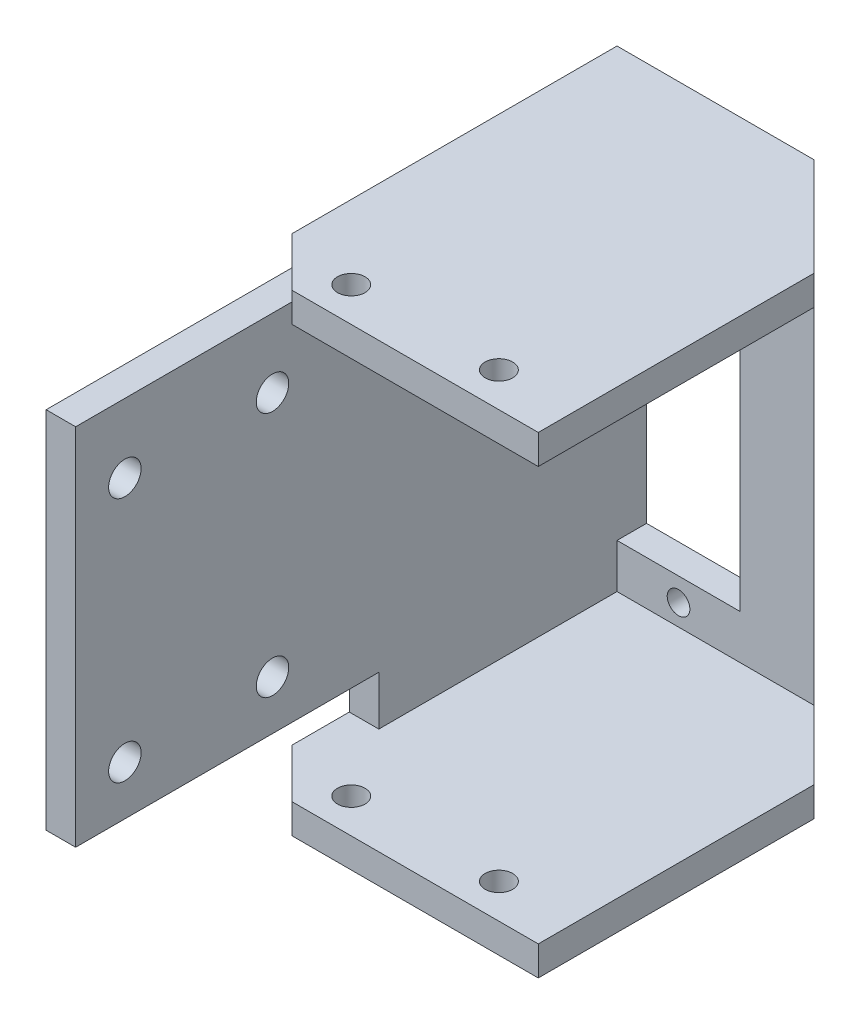
ISO-10303-21;
HEADER;
FILE_DESCRIPTION(('STEP AP214'),'2;1');
FILE_NAME('part.step','',(''),(''),'','','');
FILE_SCHEMA(('AUTOMOTIVE_DESIGN { 1 0 10303 214 1 1 1 1 }'));
ENDSEC;
DATA;
#1=APPLICATION_CONTEXT('core data for automotive mechanical design processes');
#2=APPLICATION_PROTOCOL_DEFINITION('international standard','automotive_design',2000,#1);
#3=PRODUCT_CONTEXT('',#1,'mechanical');
#4=PRODUCT('Part','Part','',(#3));
#5=PRODUCT_RELATED_PRODUCT_CATEGORY('part','',(#4));
#6=PRODUCT_DEFINITION_FORMATION('','',#4);
#7=PRODUCT_DEFINITION_CONTEXT('part definition',#1,'design');
#8=PRODUCT_DEFINITION('design','',#6,#7);
#9=PRODUCT_DEFINITION_SHAPE('','',#8);
#10=(LENGTH_UNIT() NAMED_UNIT(*) SI_UNIT(.MILLI.,.METRE.));
#11=(NAMED_UNIT(*) PLANE_ANGLE_UNIT() SI_UNIT($,.RADIAN.));
#12=(NAMED_UNIT(*) SI_UNIT($,.STERADIAN.) SOLID_ANGLE_UNIT());
#13=UNCERTAINTY_MEASURE_WITH_UNIT(LENGTH_MEASURE(1.E-05),#10,'distance_accuracy_value','');
#14=(GEOMETRIC_REPRESENTATION_CONTEXT(3) GLOBAL_UNCERTAINTY_ASSIGNED_CONTEXT((#13)) GLOBAL_UNIT_ASSIGNED_CONTEXT((#10,
#11,#12)) REPRESENTATION_CONTEXT('',''));
#15=CARTESIAN_POINT('',(0.,0.,0.));
#16=DIRECTION('',(0.,0.,1.));
#17=DIRECTION('',(1.,0.,0.));
#18=AXIS2_PLACEMENT_3D('',#15,#16,#17);
#19=CARTESIAN_POINT('',(0.,0.,3.));
#20=DIRECTION('',(0.,0.,-1.));
#21=DIRECTION('',(-1.,0.,0.));
#22=AXIS2_PLACEMENT_3D('',#19,#20,#21);
#23=PLANE('',#22);
#24=DIRECTION('',(0.,1.,0.));
#25=VECTOR('',#24,1.);
#26=CARTESIAN_POINT('',(15.5,7.49999999999995,3.));
#27=LINE('',#26,#25);
#28=CARTESIAN_POINT('',(15.5,7.49999999999995,3.));
#29=VERTEX_POINT('',#28);
#30=CARTESIAN_POINT('',(15.5,30.4999999999999,3.));
#31=VERTEX_POINT('',#30);
#32=EDGE_CURVE('E278',#29,#31,#27,.T.);
#33=ORIENTED_EDGE('',*,*,#32,.F.);
#34=DIRECTION('',(1.,0.,0.));
#35=VECTOR('',#34,1.);
#36=CARTESIAN_POINT('',(15.5,7.49999999999995,3.));
#37=LINE('',#36,#35);
#38=CARTESIAN_POINT('',(3.00000000000008,7.49999999999995,3.));
#39=VERTEX_POINT('',#38);
#40=EDGE_CURVE('E285',#39,#29,#37,.T.);
#41=ORIENTED_EDGE('',*,*,#40,.F.);
#42=DIRECTION('',(0.,1.,0.));
#43=VECTOR('',#42,1.);
#44=CARTESIAN_POINT('',(3.00000000000008,3.,3.));
#45=LINE('',#44,#43);
#46=CARTESIAN_POINT('',(3.00000000000008,3.,3.));
#47=VERTEX_POINT('',#46);
#48=EDGE_CURVE('E331',#47,#39,#45,.T.);
#49=ORIENTED_EDGE('',*,*,#48,.F.);
#50=DIRECTION('',(-1.,0.,0.));
#51=VECTOR('',#50,1.);
#52=CARTESIAN_POINT('',(0.,3.,3.));
#53=LINE('',#52,#51);
#54=CARTESIAN_POINT('',(22.9999999999999,3.,3.));
#55=VERTEX_POINT('',#54);
#56=EDGE_CURVE('E386',#55,#47,#53,.T.);
#57=ORIENTED_EDGE('',*,*,#56,.F.);
#58=DIRECTION('',(0.,1.,0.));
#59=VECTOR('',#58,1.);
#60=CARTESIAN_POINT('',(22.9999999999999,0.,3.));
#61=LINE('',#60,#59);
#62=CARTESIAN_POINT('',(22.9999999999999,45.,3.));
#63=VERTEX_POINT('',#62);
#64=EDGE_CURVE('E348',#55,#63,#61,.T.);
#65=ORIENTED_EDGE('',*,*,#64,.T.);
#66=DIRECTION('',(1.,0.,0.));
#67=VECTOR('',#66,1.);
#68=CARTESIAN_POINT('',(0.,45.,3.));
#69=LINE('',#68,#67);
#70=CARTESIAN_POINT('',(3.00000000000008,45.,3.));
#71=VERTEX_POINT('',#70);
#72=EDGE_CURVE('E378',#71,#63,#69,.T.);
#73=ORIENTED_EDGE('',*,*,#72,.F.);
#74=CARTESIAN_POINT('',(3.00000000000008,30.4999999999999,3.));
#75=VERTEX_POINT('',#74);
#76=EDGE_CURVE('E330',#75,#71,#45,.T.);
#77=ORIENTED_EDGE('',*,*,#76,.F.);
#78=DIRECTION('',(-1.,0.,0.));
#79=VECTOR('',#78,1.);
#80=CARTESIAN_POINT('',(15.5,30.4999999999999,3.));
#81=LINE('',#80,#79);
#82=EDGE_CURVE('E283',#31,#75,#81,.T.);
#83=ORIENTED_EDGE('',*,*,#82,.F.);
#84=EDGE_LOOP('',(#33,#41,#49,#57,#65,#73,#77,#83));
#85=FACE_BOUND('',#84,.T.);
#86=CARTESIAN_POINT('',(9.24999999999998,32.85,3.));
#87=DIRECTION('',(0.,0.,1.));
#88=DIRECTION('',(1.,0.,0.));
#89=AXIS2_PLACEMENT_3D('',#86,#87,#88);
#90=CIRCLE('',#89,1.15);
#91=CARTESIAN_POINT('',(10.4,32.85,3.));
#92=VERTEX_POINT('',#91);
#93=EDGE_CURVE('E275',#92,#92,#90,.T.);
#94=ORIENTED_EDGE('',*,*,#93,.F.);
#95=EDGE_LOOP('',(#94));
#96=FACE_BOUND('',#95,.T.);
#97=CARTESIAN_POINT('',(9.24999999999998,5.14999999999995,3.));
#98=DIRECTION('',(0.,0.,1.));
#99=DIRECTION('',(1.,0.,0.));
#100=AXIS2_PLACEMENT_3D('',#97,#98,#99);
#101=CIRCLE('',#100,1.15);
#102=CARTESIAN_POINT('',(10.4,5.14999999999995,3.));
#103=VERTEX_POINT('',#102);
#104=EDGE_CURVE('E274',#103,#103,#101,.T.);
#105=ORIENTED_EDGE('',*,*,#104,.F.);
#106=EDGE_LOOP('',(#105));
#107=FACE_BOUND('',#106,.T.);
#108=DIRECTION('',(0.,-1.,0.));
#109=VECTOR('',#108,1.);
#110=CARTESIAN_POINT('',(6.37375600474519,35.5569230144234,3.));
#111=LINE('',#110,#109);
#112=CARTESIAN_POINT('',(6.37375600474519,40.231274425459,3.));
#113=VERTEX_POINT('',#112);
#114=CARTESIAN_POINT('',(6.37375600474519,35.5569230144234,3.));
#115=VERTEX_POINT('',#114);
#116=EDGE_CURVE('E226',#113,#115,#111,.T.);
#117=ORIENTED_EDGE('',*,*,#116,.F.);
#118=DIRECTION('',(-1.,0.,0.));
#119=VECTOR('',#118,1.);
#120=CARTESIAN_POINT('',(6.37375600474519,40.231274425459,3.));
#121=LINE('',#120,#119);
#122=CARTESIAN_POINT('',(11.928177846488,40.231274425459,3.));
#123=VERTEX_POINT('',#122);
#124=EDGE_CURVE('E223',#123,#113,#121,.T.);
#125=ORIENTED_EDGE('',*,*,#124,.F.);
#126=DIRECTION('',(0.,1.,0.));
#127=VECTOR('',#126,1.);
#128=CARTESIAN_POINT('',(11.928177846488,35.5569230144234,3.));
#129=LINE('',#128,#127);
#130=CARTESIAN_POINT('',(11.928177846488,35.5569230144234,3.));
#131=VERTEX_POINT('',#130);
#132=EDGE_CURVE('E61',#131,#123,#129,.T.);
#133=ORIENTED_EDGE('',*,*,#132,.F.);
#134=DIRECTION('',(1.,0.,0.));
#135=VECTOR('',#134,1.);
#136=CARTESIAN_POINT('',(6.37375600474519,35.5569230144234,3.));
#137=LINE('',#136,#135);
#138=EDGE_CURVE('E56',#115,#131,#137,.T.);
#139=ORIENTED_EDGE('',*,*,#138,.F.);
#140=EDGE_LOOP('',(#117,#125,#133,#139));
#141=FACE_BOUND('',#140,.T.);
#142=ADVANCED_FACE('F41',(#85,#96,#107,#141),#23,.F.);
#143=CARTESIAN_POINT('',(0.,3.,38.));
#144=DIRECTION('',(0.,-1.,0.));
#145=DIRECTION('',(0.,0.,-1.));
#146=AXIS2_PLACEMENT_3D('',#143,#144,#145);
#147=PLANE('',#146);
#148=CARTESIAN_POINT('',(22.5,3.,34.5000000000001));
#149=DIRECTION('',(0.,-1.,0.));
#150=DIRECTION('',(0.,0.,-1.));
#151=AXIS2_PLACEMENT_3D('',#148,#149,#150);
#152=CIRCLE('',#151,1.4);
#153=CARTESIAN_POINT('',(22.5,3.,33.1000000000001));
#154=VERTEX_POINT('',#153);
#155=EDGE_CURVE('E256',#154,#154,#152,.T.);
#156=ORIENTED_EDGE('',*,*,#155,.T.);
#157=EDGE_LOOP('',(#156));
#158=FACE_BOUND('',#157,.T.);
#159=CARTESIAN_POINT('',(7.50000000000001,3.,34.5000000000003));
#160=DIRECTION('',(0.,-1.,0.));
#161=DIRECTION('',(0.,0.,-1.));
#162=AXIS2_PLACEMENT_3D('',#159,#160,#161);
#163=CIRCLE('',#162,1.4);
#164=CARTESIAN_POINT('',(7.50000000000001,3.,33.1000000000003));
#165=VERTEX_POINT('',#164);
#166=EDGE_CURVE('E250',#165,#165,#163,.T.);
#167=ORIENTED_EDGE('',*,*,#166,.T.);
#168=EDGE_LOOP('',(#167));
#169=FACE_BOUND('',#168,.T.);
#170=DIRECTION('',(0.,0.,-1.));
#171=VECTOR('',#170,1.);
#172=CARTESIAN_POINT('',(3.00000000000008,3.,28.));
#173=LINE('',#172,#171);
#174=CARTESIAN_POINT('',(3.00000000000008,3.,27.2));
#175=VERTEX_POINT('',#174);
#176=EDGE_CURVE('E337',#175,#47,#173,.T.);
#177=ORIENTED_EDGE('',*,*,#176,.F.);
#178=DIRECTION('',(-1.,0.,0.));
#179=VECTOR('',#178,1.);
#180=CARTESIAN_POINT('',(10.,3.,27.2));
#181=LINE('',#180,#179);
#182=CARTESIAN_POINT('',(0.,3.,27.2));
#183=VERTEX_POINT('',#182);
#184=EDGE_CURVE('E268',#175,#183,#181,.T.);
#185=ORIENTED_EDGE('',*,*,#184,.T.);
#186=DIRECTION('',(0.,0.,1.));
#187=VECTOR('',#186,1.);
#188=CARTESIAN_POINT('',(0.,3.,58.));
#189=LINE('',#188,#187);
#190=CARTESIAN_POINT('',(0.,3.,33.));
#191=VERTEX_POINT('',#190);
#192=EDGE_CURVE('E265',#183,#191,#189,.T.);
#193=ORIENTED_EDGE('',*,*,#192,.T.);
#194=DIRECTION('',(0.707106781186544,0.,0.707106781186551));
#195=VECTOR('',#194,1.);
#196=CARTESIAN_POINT('',(2.50000000000003,3.,35.5));
#197=LINE('',#196,#195);
#198=CARTESIAN_POINT('',(5.,3.,38.));
#199=VERTEX_POINT('',#198);
#200=EDGE_CURVE('E371',#191,#199,#197,.T.);
#201=ORIENTED_EDGE('',*,*,#200,.T.);
#202=DIRECTION('',(-1.,0.,0.));
#203=VECTOR('',#202,1.);
#204=CARTESIAN_POINT('',(0.,3.,38.));
#205=LINE('',#204,#203);
#206=CARTESIAN_POINT('',(30.,3.,38.));
#207=VERTEX_POINT('',#206);
#208=EDGE_CURVE('E392',#207,#199,#205,.T.);
#209=ORIENTED_EDGE('',*,*,#208,.F.);
#210=DIRECTION('',(0.,0.,-1.));
#211=VECTOR('',#210,1.);
#212=CARTESIAN_POINT('',(30.,3.,38.));
#213=LINE('',#212,#211);
#214=CARTESIAN_POINT('',(30.,3.,10.));
#215=VERTEX_POINT('',#214);
#216=EDGE_CURVE('E374',#207,#215,#213,.T.);
#217=ORIENTED_EDGE('',*,*,#216,.T.);
#218=DIRECTION('',(-0.707106781186551,0.,-0.707106781186544));
#219=VECTOR('',#218,1.);
#220=CARTESIAN_POINT('',(28.9999999999998,3.,8.99999999999986));
#221=LINE('',#220,#219);
#222=EDGE_CURVE('E353',#215,#55,#221,.T.);
#223=ORIENTED_EDGE('',*,*,#222,.T.);
#224=ORIENTED_EDGE('',*,*,#56,.T.);
#225=EDGE_LOOP('',(#177,#185,#193,#201,#209,#217,#223,#224));
#226=FACE_BOUND('',#225,.T.);
#227=ADVANCED_FACE('F491',(#158,#169,#226),#147,.F.);
#228=CARTESIAN_POINT('',(0.,45.,38.));
#229=DIRECTION('',(0.,1.,0.));
#230=DIRECTION('',(0.,0.,1.));
#231=AXIS2_PLACEMENT_3D('',#228,#229,#230);
#232=PLANE('',#231);
#233=CARTESIAN_POINT('',(22.5,45.,34.5000000000001));
#234=DIRECTION('',(0.,1.,0.));
#235=DIRECTION('',(0.,0.,1.));
#236=AXIS2_PLACEMENT_3D('',#233,#234,#235);
#237=CIRCLE('',#236,1.4);
#238=CARTESIAN_POINT('',(22.5,45.,35.9000000000001));
#239=VERTEX_POINT('',#238);
#240=EDGE_CURVE('E253',#239,#239,#237,.T.);
#241=ORIENTED_EDGE('',*,*,#240,.T.);
#242=EDGE_LOOP('',(#241));
#243=FACE_BOUND('',#242,.T.);
#244=CARTESIAN_POINT('',(7.50000000000001,45.,34.5000000000003));
#245=DIRECTION('',(0.,1.,0.));
#246=DIRECTION('',(0.,0.,1.));
#247=AXIS2_PLACEMENT_3D('',#244,#245,#246);
#248=CIRCLE('',#247,1.4);
#249=CARTESIAN_POINT('',(7.50000000000001,45.,35.9000000000003));
#250=VERTEX_POINT('',#249);
#251=EDGE_CURVE('E239',#250,#250,#248,.T.);
#252=ORIENTED_EDGE('',*,*,#251,.T.);
#253=EDGE_LOOP('',(#252));
#254=FACE_BOUND('',#253,.T.);
#255=DIRECTION('',(-0.707106781186544,0.,-0.707106781186551));
#256=VECTOR('',#255,1.);
#257=CARTESIAN_POINT('',(2.50000000000003,45.,35.5));
#258=LINE('',#257,#256);
#259=CARTESIAN_POINT('',(5.,45.,38.));
#260=VERTEX_POINT('',#259);
#261=CARTESIAN_POINT('',(3.00000000000008,45.,36.0000000000001));
#262=VERTEX_POINT('',#261);
#263=EDGE_CURVE('E365',#260,#262,#258,.T.);
#264=ORIENTED_EDGE('',*,*,#263,.T.);
#265=DIRECTION('',(0.,0.,-1.));
#266=VECTOR('',#265,1.);
#267=CARTESIAN_POINT('',(3.00000000000008,45.,28.));
#268=LINE('',#267,#266);
#269=EDGE_CURVE('E334',#262,#71,#268,.T.);
#270=ORIENTED_EDGE('',*,*,#269,.T.);
#271=ORIENTED_EDGE('',*,*,#72,.T.);
#272=DIRECTION('',(0.707106781186551,0.,0.707106781186544));
#273=VECTOR('',#272,1.);
#274=CARTESIAN_POINT('',(28.9999999999998,45.,8.99999999999986));
#275=LINE('',#274,#273);
#276=CARTESIAN_POINT('',(30.,45.,10.));
#277=VERTEX_POINT('',#276);
#278=EDGE_CURVE('E418',#63,#277,#275,.T.);
#279=ORIENTED_EDGE('',*,*,#278,.T.);
#280=DIRECTION('',(0.,0.,-1.));
#281=VECTOR('',#280,1.);
#282=CARTESIAN_POINT('',(30.,45.,38.));
#283=LINE('',#282,#281);
#284=CARTESIAN_POINT('',(30.,45.,38.));
#285=VERTEX_POINT('',#284);
#286=EDGE_CURVE('E384',#285,#277,#283,.T.);
#287=ORIENTED_EDGE('',*,*,#286,.F.);
#288=DIRECTION('',(1.,0.,0.));
#289=VECTOR('',#288,1.);
#290=CARTESIAN_POINT('',(0.,45.,38.));
#291=LINE('',#290,#289);
#292=EDGE_CURVE('E375',#260,#285,#291,.T.);
#293=ORIENTED_EDGE('',*,*,#292,.F.);
#294=EDGE_LOOP('',(#264,#270,#271,#279,#287,#293));
#295=FACE_BOUND('',#294,.T.);
#296=ADVANCED_FACE('F501',(#243,#254,#295),#232,.F.);
#297=CARTESIAN_POINT('',(30.,0.,3.));
#298=DIRECTION('',(-1.,0.,0.));
#299=DIRECTION('',(0.,-1.,0.));
#300=AXIS2_PLACEMENT_3D('',#297,#298,#299);
#301=PLANE('',#300);
#302=DIRECTION('',(0.,0.,-1.));
#303=VECTOR('',#302,1.);
#304=CARTESIAN_POINT('',(30.,0.,3.));
#305=LINE('',#304,#303);
#306=CARTESIAN_POINT('',(30.,0.,38.));
#307=VERTEX_POINT('',#306);
#308=CARTESIAN_POINT('',(30.,0.,10.));
#309=VERTEX_POINT('',#308);
#310=EDGE_CURVE('E413',#307,#309,#305,.T.);
#311=ORIENTED_EDGE('',*,*,#310,.T.);
#312=DIRECTION('',(0.,-1.,0.));
#313=VECTOR('',#312,1.);
#314=CARTESIAN_POINT('',(30.,48.,10.));
#315=LINE('',#314,#313);
#316=EDGE_CURVE('E343',#215,#309,#315,.T.);
#317=ORIENTED_EDGE('',*,*,#316,.F.);
#318=ORIENTED_EDGE('',*,*,#216,.F.);
#319=DIRECTION('',(0.,1.,0.));
#320=VECTOR('',#319,1.);
#321=CARTESIAN_POINT('',(30.,0.,38.));
#322=LINE('',#321,#320);
#323=EDGE_CURVE('E397',#307,#207,#322,.T.);
#324=ORIENTED_EDGE('',*,*,#323,.F.);
#325=EDGE_LOOP('',(#311,#317,#318,#324));
#326=FACE_BOUND('',#325,.T.);
#327=ADVANCED_FACE('F520',(#326),#301,.F.);
#328=CARTESIAN_POINT('',(0.,0.,3.));
#329=DIRECTION('',(1.,0.,0.));
#330=DIRECTION('',(0.,1.,0.));
#331=AXIS2_PLACEMENT_3D('',#328,#329,#330);
#332=PLANE('',#331);
#333=CARTESIAN_POINT('',(0.,13.,53.));
#334=DIRECTION('',(-1.,0.,0.));
#335=DIRECTION('',(0.,-1.,0.));
#336=AXIS2_PLACEMENT_3D('',#333,#334,#335);
#337=CIRCLE('',#336,1.65);
#338=CARTESIAN_POINT('',(0.,11.35,53.));
#339=VERTEX_POINT('',#338);
#340=EDGE_CURVE('E305',#339,#339,#337,.T.);
#341=ORIENTED_EDGE('',*,*,#340,.F.);
#342=EDGE_LOOP('',(#341));
#343=FACE_BOUND('',#342,.T.);
#344=CARTESIAN_POINT('',(0.,38.,52.9999999999998));
#345=DIRECTION('',(-1.,0.,0.));
#346=DIRECTION('',(0.,-1.,0.));
#347=AXIS2_PLACEMENT_3D('',#344,#345,#346);
#348=CIRCLE('',#347,1.65);
#349=CARTESIAN_POINT('',(0.,36.35,52.9999999999998));
#350=VERTEX_POINT('',#349);
#351=EDGE_CURVE('E302',#350,#350,#348,.T.);
#352=ORIENTED_EDGE('',*,*,#351,.F.);
#353=EDGE_LOOP('',(#352));
#354=FACE_BOUND('',#353,.T.);
#355=CARTESIAN_POINT('',(0.,37.9999999999999,37.9999999999998));
#356=DIRECTION('',(-1.,0.,0.));
#357=DIRECTION('',(0.,-1.,0.));
#358=AXIS2_PLACEMENT_3D('',#355,#356,#357);
#359=CIRCLE('',#358,1.65);
#360=CARTESIAN_POINT('',(0.,36.3499999999999,37.9999999999998));
#361=VERTEX_POINT('',#360);
#362=EDGE_CURVE('E298',#361,#361,#359,.T.);
#363=ORIENTED_EDGE('',*,*,#362,.F.);
#364=EDGE_LOOP('',(#363));
#365=FACE_BOUND('',#364,.T.);
#366=CARTESIAN_POINT('',(0.,12.9999999999999,38.));
#367=DIRECTION('',(-1.,0.,0.));
#368=DIRECTION('',(0.,-1.,0.));
#369=AXIS2_PLACEMENT_3D('',#366,#367,#368);
#370=CIRCLE('',#369,1.65);
#371=CARTESIAN_POINT('',(0.,11.3499999999999,38.));
#372=VERTEX_POINT('',#371);
#373=EDGE_CURVE('E301',#372,#372,#370,.T.);
#374=ORIENTED_EDGE('',*,*,#373,.F.);
#375=EDGE_LOOP('',(#374));
#376=FACE_BOUND('',#375,.T.);
#377=DIRECTION('',(0.,-1.,0.));
#378=VECTOR('',#377,1.);
#379=CARTESIAN_POINT('',(0.,48.,33.));
#380=LINE('',#379,#378);
#381=CARTESIAN_POINT('',(0.,0.,33.));
#382=VERTEX_POINT('',#381);
#383=EDGE_CURVE('E360',#191,#382,#380,.T.);
#384=ORIENTED_EDGE('',*,*,#383,.F.);
#385=ORIENTED_EDGE('',*,*,#192,.F.);
#386=DIRECTION('',(0.,-1.,0.));
#387=VECTOR('',#386,1.);
#388=CARTESIAN_POINT('',(0.,3.,27.2));
#389=LINE('',#388,#387);
#390=CARTESIAN_POINT('',(0.,8.00000000000001,27.2));
#391=VERTEX_POINT('',#390);
#392=EDGE_CURVE('E262',#391,#183,#389,.T.);
#393=ORIENTED_EDGE('',*,*,#392,.F.);
#394=DIRECTION('',(0.,0.,-1.));
#395=VECTOR('',#394,1.);
#396=CARTESIAN_POINT('',(0.,8.00000000000001,58.));
#397=LINE('',#396,#395);
#398=CARTESIAN_POINT('',(0.,8.00000000000001,58.));
#399=VERTEX_POINT('',#398);
#400=EDGE_CURVE('E259',#399,#391,#397,.T.);
#401=ORIENTED_EDGE('',*,*,#400,.F.);
#402=DIRECTION('',(0.,-1.,0.));
#403=VECTOR('',#402,1.);
#404=CARTESIAN_POINT('',(0.,45.,58.));
#405=LINE('',#404,#403);
#406=CARTESIAN_POINT('',(0.,45.,58.));
#407=VERTEX_POINT('',#406);
#408=EDGE_CURVE('E315',#407,#399,#405,.T.);
#409=ORIENTED_EDGE('',*,*,#408,.F.);
#410=DIRECTION('',(0.,0.,-1.));
#411=VECTOR('',#410,1.);
#412=CARTESIAN_POINT('',(0.,45.,58.));
#413=LINE('',#412,#411);
#414=CARTESIAN_POINT('',(0.,45.,33.));
#415=VERTEX_POINT('',#414);
#416=EDGE_CURVE('E324',#407,#415,#413,.T.);
#417=ORIENTED_EDGE('',*,*,#416,.T.);
#418=CARTESIAN_POINT('',(0.,48.,33.));
#419=VERTEX_POINT('',#418);
#420=EDGE_CURVE('E367',#419,#415,#380,.T.);
#421=ORIENTED_EDGE('',*,*,#420,.F.);
#422=DIRECTION('',(0.,0.,-1.));
#423=VECTOR('',#422,1.);
#424=CARTESIAN_POINT('',(0.,48.,3.));
#425=LINE('',#424,#423);
#426=CARTESIAN_POINT('',(0.,48.,0.));
#427=VERTEX_POINT('',#426);
#428=EDGE_CURVE('E407',#419,#427,#425,.T.);
#429=ORIENTED_EDGE('',*,*,#428,.T.);
#430=DIRECTION('',(0.,-1.,0.));
#431=VECTOR('',#430,1.);
#432=CARTESIAN_POINT('',(0.,0.,0.));
#433=LINE('',#432,#431);
#434=CARTESIAN_POINT('',(0.,0.,0.));
#435=VERTEX_POINT('',#434);
#436=EDGE_CURVE('E389',#427,#435,#433,.T.);
#437=ORIENTED_EDGE('',*,*,#436,.T.);
#438=DIRECTION('',(0.,0.,-1.));
#439=VECTOR('',#438,1.);
#440=CARTESIAN_POINT('',(0.,0.,3.));
#441=LINE('',#440,#439);
#442=EDGE_CURVE('E416',#382,#435,#441,.T.);
#443=ORIENTED_EDGE('',*,*,#442,.F.);
#444=EDGE_LOOP('',(#384,#385,#393,#401,#409,#417,#421,#429,#437,#443));
#445=FACE_BOUND('',#444,.T.);
#446=ADVANCED_FACE('F43',(#343,#354,#365,#376,#445),#332,.F.);
#447=CARTESIAN_POINT('',(0.,0.,3.));
#448=DIRECTION('',(0.,1.,0.));
#449=DIRECTION('',(0.,0.,1.));
#450=AXIS2_PLACEMENT_3D('',#447,#448,#449);
#451=PLANE('',#450);
#452=CARTESIAN_POINT('',(22.5,0.,34.5000000000001));
#453=DIRECTION('',(0.,-1.,0.));
#454=DIRECTION('',(0.,0.,-1.));
#455=AXIS2_PLACEMENT_3D('',#452,#453,#454);
#456=CIRCLE('',#455,1.4);
#457=CARTESIAN_POINT('',(22.5,0.,33.1000000000001));
#458=VERTEX_POINT('',#457);
#459=EDGE_CURVE('E240',#458,#458,#456,.T.);
#460=ORIENTED_EDGE('',*,*,#459,.F.);
#461=EDGE_LOOP('',(#460));
#462=FACE_BOUND('',#461,.T.);
#463=CARTESIAN_POINT('',(7.50000000000001,0.,34.5000000000003));
#464=DIRECTION('',(0.,-1.,0.));
#465=DIRECTION('',(0.,0.,-1.));
#466=AXIS2_PLACEMENT_3D('',#463,#464,#465);
#467=CIRCLE('',#466,1.4);
#468=CARTESIAN_POINT('',(7.50000000000001,0.,33.1000000000003));
#469=VERTEX_POINT('',#468);
#470=EDGE_CURVE('E243',#469,#469,#467,.T.);
#471=ORIENTED_EDGE('',*,*,#470,.F.);
#472=EDGE_LOOP('',(#471));
#473=FACE_BOUND('',#472,.T.);
#474=DIRECTION('',(1.,0.,0.));
#475=VECTOR('',#474,1.);
#476=CARTESIAN_POINT('',(0.,0.,0.));
#477=LINE('',#476,#475);
#478=CARTESIAN_POINT('',(19.9999999999999,0.,0.));
#479=VERTEX_POINT('',#478);
#480=EDGE_CURVE('E402',#435,#479,#477,.T.);
#481=ORIENTED_EDGE('',*,*,#480,.T.);
#482=DIRECTION('',(-0.707106781186551,0.,-0.707106781186544));
#483=VECTOR('',#482,1.);
#484=CARTESIAN_POINT('',(19.9999999999999,0.,0.));
#485=LINE('',#484,#483);
#486=EDGE_CURVE('E339',#309,#479,#485,.T.);
#487=ORIENTED_EDGE('',*,*,#486,.F.);
#488=ORIENTED_EDGE('',*,*,#310,.F.);
#489=DIRECTION('',(1.,0.,0.));
#490=VECTOR('',#489,1.);
#491=CARTESIAN_POINT('',(0.,0.,38.));
#492=LINE('',#491,#490);
#493=CARTESIAN_POINT('',(5.,0.,38.));
#494=VERTEX_POINT('',#493);
#495=EDGE_CURVE('E395',#494,#307,#492,.T.);
#496=ORIENTED_EDGE('',*,*,#495,.F.);
#497=DIRECTION('',(0.707106781186544,0.,0.707106781186551));
#498=VECTOR('',#497,1.);
#499=CARTESIAN_POINT('',(0.,0.,33.));
#500=LINE('',#499,#498);
#501=EDGE_CURVE('E356',#382,#494,#500,.T.);
#502=ORIENTED_EDGE('',*,*,#501,.F.);
#503=ORIENTED_EDGE('',*,*,#442,.T.);
#504=EDGE_LOOP('',(#481,#487,#488,#496,#502,#503));
#505=FACE_BOUND('',#504,.T.);
#506=ADVANCED_FACE('F475',(#462,#473,#505),#451,.F.);
#507=ORIENTED_EDGE('',*,*,#286,.T.);
#508=CARTESIAN_POINT('',(30.,48.,10.));
#509=VERTEX_POINT('',#508);
#510=EDGE_CURVE('E349',#509,#277,#315,.T.);
#511=ORIENTED_EDGE('',*,*,#510,.F.);
#512=DIRECTION('',(0.,0.,-1.));
#513=VECTOR('',#512,1.);
#514=CARTESIAN_POINT('',(30.,48.,3.));
#515=LINE('',#514,#513);
#516=CARTESIAN_POINT('',(30.,48.,38.));
#517=VERTEX_POINT('',#516);
#518=EDGE_CURVE('E410',#517,#509,#515,.T.);
#519=ORIENTED_EDGE('',*,*,#518,.F.);
#520=DIRECTION('',(0.,1.,0.));
#521=VECTOR('',#520,1.);
#522=CARTESIAN_POINT('',(30.,48.,38.));
#523=LINE('',#522,#521);
#524=EDGE_CURVE('E377',#285,#517,#523,.T.);
#525=ORIENTED_EDGE('',*,*,#524,.F.);
#526=EDGE_LOOP('',(#507,#511,#519,#525));
#527=FACE_BOUND('',#526,.T.);
#528=ADVANCED_FACE('F508',(#527),#301,.F.);
#529=CARTESIAN_POINT('',(0.,48.,3.));
#530=DIRECTION('',(0.,-1.,0.));
#531=DIRECTION('',(0.,0.,-1.));
#532=AXIS2_PLACEMENT_3D('',#529,#530,#531);
#533=PLANE('',#532);
#534=CARTESIAN_POINT('',(22.5,48.,34.5000000000001));
#535=DIRECTION('',(0.,-1.,0.));
#536=DIRECTION('',(0.,0.,-1.));
#537=AXIS2_PLACEMENT_3D('',#534,#535,#536);
#538=CIRCLE('',#537,1.4);
#539=CARTESIAN_POINT('',(22.5,48.,33.1000000000001));
#540=VERTEX_POINT('',#539);
#541=EDGE_CURVE('E236',#540,#540,#538,.T.);
#542=ORIENTED_EDGE('',*,*,#541,.T.);
#543=EDGE_LOOP('',(#542));
#544=FACE_BOUND('',#543,.T.);
#545=CARTESIAN_POINT('',(7.50000000000001,48.,34.5000000000003));
#546=DIRECTION('',(0.,-1.,0.));
#547=DIRECTION('',(0.,0.,-1.));
#548=AXIS2_PLACEMENT_3D('',#545,#546,#547);
#549=CIRCLE('',#548,1.4);
#550=CARTESIAN_POINT('',(7.50000000000001,48.,33.1000000000003));
#551=VERTEX_POINT('',#550);
#552=EDGE_CURVE('E230',#551,#551,#549,.T.);
#553=ORIENTED_EDGE('',*,*,#552,.T.);
#554=EDGE_LOOP('',(#553));
#555=FACE_BOUND('',#554,.T.);
#556=ORIENTED_EDGE('',*,*,#518,.T.);
#557=DIRECTION('',(-0.707106781186551,0.,-0.707106781186544));
#558=VECTOR('',#557,1.);
#559=CARTESIAN_POINT('',(19.9999999999999,48.,0.));
#560=LINE('',#559,#558);
#561=CARTESIAN_POINT('',(19.9999999999999,48.,0.));
#562=VERTEX_POINT('',#561);
#563=EDGE_CURVE('E340',#509,#562,#560,.T.);
#564=ORIENTED_EDGE('',*,*,#563,.T.);
#565=DIRECTION('',(-1.,0.,0.));
#566=VECTOR('',#565,1.);
#567=CARTESIAN_POINT('',(0.,48.,0.));
#568=LINE('',#567,#566);
#569=EDGE_CURVE('E405',#562,#427,#568,.T.);
#570=ORIENTED_EDGE('',*,*,#569,.T.);
#571=ORIENTED_EDGE('',*,*,#428,.F.);
#572=DIRECTION('',(0.707106781186544,0.,0.707106781186551));
#573=VECTOR('',#572,1.);
#574=CARTESIAN_POINT('',(0.,48.,33.));
#575=LINE('',#574,#573);
#576=CARTESIAN_POINT('',(5.,48.,38.));
#577=VERTEX_POINT('',#576);
#578=EDGE_CURVE('E357',#419,#577,#575,.T.);
#579=ORIENTED_EDGE('',*,*,#578,.T.);
#580=DIRECTION('',(-1.,0.,0.));
#581=VECTOR('',#580,1.);
#582=CARTESIAN_POINT('',(0.,48.,38.));
#583=LINE('',#582,#581);
#584=EDGE_CURVE('E381',#517,#577,#583,.T.);
#585=ORIENTED_EDGE('',*,*,#584,.F.);
#586=EDGE_LOOP('',(#556,#564,#570,#571,#579,#585));
#587=FACE_BOUND('',#586,.T.);
#588=ADVANCED_FACE('F466',(#544,#555,#587),#533,.F.);
#589=CARTESIAN_POINT('',(0.,0.,0.));
#590=DIRECTION('',(0.,0.,-1.));
#591=DIRECTION('',(-1.,0.,0.));
#592=AXIS2_PLACEMENT_3D('',#589,#590,#591);
#593=PLANE('',#592);
#594=CARTESIAN_POINT('',(9.25,37.75,0.));
#595=DIRECTION('',(0.,0.,-1.));
#596=DIRECTION('',(-1.,0.,0.));
#597=AXIS2_PLACEMENT_3D('',#594,#595,#596);
#598=CIRCLE('',#597,2.);
#599=CARTESIAN_POINT('',(7.25,37.75,0.));
#600=VERTEX_POINT('',#599);
#601=EDGE_CURVE('E227',#600,#600,#598,.T.);
#602=ORIENTED_EDGE('',*,*,#601,.F.);
#603=EDGE_LOOP('',(#602));
#604=FACE_BOUND('',#603,.T.);
#605=CARTESIAN_POINT('',(9.24999999999998,5.14999999999995,0.));
#606=DIRECTION('',(0.,0.,-1.));
#607=DIRECTION('',(-1.,0.,0.));
#608=AXIS2_PLACEMENT_3D('',#605,#606,#607);
#609=CIRCLE('',#608,1.15);
#610=CARTESIAN_POINT('',(8.09999999999997,5.14999999999995,0.));
#611=VERTEX_POINT('',#610);
#612=EDGE_CURVE('E308',#611,#611,#609,.T.);
#613=ORIENTED_EDGE('',*,*,#612,.F.);
#614=EDGE_LOOP('',(#613));
#615=FACE_BOUND('',#614,.T.);
#616=CARTESIAN_POINT('',(9.24999999999998,32.85,0.));
#617=DIRECTION('',(0.,0.,-1.));
#618=DIRECTION('',(-1.,0.,0.));
#619=AXIS2_PLACEMENT_3D('',#616,#617,#618);
#620=CIRCLE('',#619,1.15);
#621=CARTESIAN_POINT('',(8.09999999999998,32.85,0.));
#622=VERTEX_POINT('',#621);
#623=EDGE_CURVE('E291',#622,#622,#620,.T.);
#624=ORIENTED_EDGE('',*,*,#623,.F.);
#625=EDGE_LOOP('',(#624));
#626=FACE_BOUND('',#625,.T.);
#627=DIRECTION('',(0.,-1.,0.));
#628=VECTOR('',#627,1.);
#629=CARTESIAN_POINT('',(15.5,0.,0.));
#630=LINE('',#629,#628);
#631=CARTESIAN_POINT('',(15.5,30.4999999999999,0.));
#632=VERTEX_POINT('',#631);
#633=CARTESIAN_POINT('',(15.5,7.49999999999995,0.));
#634=VERTEX_POINT('',#633);
#635=EDGE_CURVE('E438',#632,#634,#630,.T.);
#636=ORIENTED_EDGE('',*,*,#635,.F.);
#637=DIRECTION('',(1.,0.,0.));
#638=VECTOR('',#637,1.);
#639=CARTESIAN_POINT('',(0.,30.4999999999999,0.));
#640=LINE('',#639,#638);
#641=CARTESIAN_POINT('',(3.00000000000008,30.4999999999999,0.));
#642=VERTEX_POINT('',#641);
#643=EDGE_CURVE('E421',#642,#632,#640,.T.);
#644=ORIENTED_EDGE('',*,*,#643,.F.);
#645=DIRECTION('',(0.,1.,0.));
#646=VECTOR('',#645,1.);
#647=CARTESIAN_POINT('',(3.00000000000008,0.,0.));
#648=LINE('',#647,#646);
#649=CARTESIAN_POINT('',(3.00000000000008,7.49999999999995,0.));
#650=VERTEX_POINT('',#649);
#651=EDGE_CURVE('E433',#650,#642,#648,.T.);
#652=ORIENTED_EDGE('',*,*,#651,.F.);
#653=DIRECTION('',(-1.,0.,0.));
#654=VECTOR('',#653,1.);
#655=CARTESIAN_POINT('',(0.,7.49999999999995,0.));
#656=LINE('',#655,#654);
#657=EDGE_CURVE('E436',#634,#650,#656,.T.);
#658=ORIENTED_EDGE('',*,*,#657,.F.);
#659=EDGE_LOOP('',(#636,#644,#652,#658));
#660=FACE_BOUND('',#659,.T.);
#661=DIRECTION('',(0.,-1.,0.));
#662=VECTOR('',#661,1.);
#663=CARTESIAN_POINT('',(19.9999999999999,48.,0.));
#664=LINE('',#663,#662);
#665=EDGE_CURVE('E345',#562,#479,#664,.T.);
#666=ORIENTED_EDGE('',*,*,#665,.T.);
#667=ORIENTED_EDGE('',*,*,#480,.F.);
#668=ORIENTED_EDGE('',*,*,#436,.F.);
#669=ORIENTED_EDGE('',*,*,#569,.F.);
#670=EDGE_LOOP('',(#666,#667,#668,#669));
#671=FACE_BOUND('',#670,.T.);
#672=ADVANCED_FACE('F470',(#604,#615,#626,#660,#671),#593,.T.);
#673=CARTESIAN_POINT('',(0.,0.,38.));
#674=DIRECTION('',(0.,0.,-1.));
#675=DIRECTION('',(-1.,0.,0.));
#676=AXIS2_PLACEMENT_3D('',#673,#674,#675);
#677=PLANE('',#676);
#678=ORIENTED_EDGE('',*,*,#208,.T.);
#679=DIRECTION('',(0.,-1.,0.));
#680=VECTOR('',#679,1.);
#681=CARTESIAN_POINT('',(5.,48.,38.));
#682=LINE('',#681,#680);
#683=EDGE_CURVE('E366',#199,#494,#682,.T.);
#684=ORIENTED_EDGE('',*,*,#683,.T.);
#685=ORIENTED_EDGE('',*,*,#495,.T.);
#686=ORIENTED_EDGE('',*,*,#323,.T.);
#687=EDGE_LOOP('',(#678,#684,#685,#686));
#688=FACE_BOUND('',#687,.T.);
#689=ADVANCED_FACE('F485',(#688),#677,.F.);
#690=CARTESIAN_POINT('',(0.,0.,38.));
#691=DIRECTION('',(0.,0.,1.));
#692=DIRECTION('',(1.,0.,0.));
#693=AXIS2_PLACEMENT_3D('',#690,#691,#692);
#694=PLANE('',#693);
#695=EDGE_CURVE('E362',#577,#260,#682,.T.);
#696=ORIENTED_EDGE('',*,*,#695,.T.);
#697=ORIENTED_EDGE('',*,*,#292,.T.);
#698=ORIENTED_EDGE('',*,*,#524,.T.);
#699=ORIENTED_EDGE('',*,*,#584,.T.);
#700=EDGE_LOOP('',(#696,#697,#698,#699));
#701=FACE_BOUND('',#700,.T.);
#702=ADVANCED_FACE('F505',(#701),#694,.T.);
#703=CARTESIAN_POINT('',(0.,48.,33.));
#704=DIRECTION('',(0.707106781186551,0.,-0.707106781186544));
#705=DIRECTION('',(-0.707106781186544,0.,-0.707106781186551));
#706=AXIS2_PLACEMENT_3D('',#703,#704,#705);
#707=PLANE('',#706);
#708=ORIENTED_EDGE('',*,*,#695,.F.);
#709=ORIENTED_EDGE('',*,*,#578,.F.);
#710=ORIENTED_EDGE('',*,*,#420,.T.);
#711=DIRECTION('',(-0.707106781186544,0.,-0.707106781186551));
#712=VECTOR('',#711,1.);
#713=CARTESIAN_POINT('',(0.,45.,33.));
#714=LINE('',#713,#712);
#715=EDGE_CURVE('E327',#262,#415,#714,.T.);
#716=ORIENTED_EDGE('',*,*,#715,.F.);
#717=ORIENTED_EDGE('',*,*,#263,.F.);
#718=EDGE_LOOP('',(#708,#709,#710,#716,#717));
#719=FACE_BOUND('',#718,.T.);
#720=ADVANCED_FACE('F499',(#719),#707,.F.);
#721=ORIENTED_EDGE('',*,*,#383,.T.);
#722=ORIENTED_EDGE('',*,*,#501,.T.);
#723=ORIENTED_EDGE('',*,*,#683,.F.);
#724=ORIENTED_EDGE('',*,*,#200,.F.);
#725=EDGE_LOOP('',(#721,#722,#723,#724));
#726=FACE_BOUND('',#725,.T.);
#727=ADVANCED_FACE('F482',(#726),#707,.F.);
#728=CARTESIAN_POINT('',(19.9999999999999,48.,0.));
#729=DIRECTION('',(-0.707106781186544,0.,0.707106781186551));
#730=DIRECTION('',(0.707106781186551,0.,0.707106781186544));
#731=AXIS2_PLACEMENT_3D('',#728,#729,#730);
#732=PLANE('',#731);
#733=ORIENTED_EDGE('',*,*,#316,.T.);
#734=ORIENTED_EDGE('',*,*,#486,.T.);
#735=ORIENTED_EDGE('',*,*,#665,.F.);
#736=ORIENTED_EDGE('',*,*,#563,.F.);
#737=ORIENTED_EDGE('',*,*,#510,.T.);
#738=ORIENTED_EDGE('',*,*,#278,.F.);
#739=ORIENTED_EDGE('',*,*,#64,.F.);
#740=ORIENTED_EDGE('',*,*,#222,.F.);
#741=EDGE_LOOP('',(#733,#734,#735,#736,#737,#738,#739,#740));
#742=FACE_BOUND('',#741,.T.);
#743=ADVANCED_FACE('F511',(#742),#732,.F.);
#744=CARTESIAN_POINT('',(3.00000000000008,3.,28.));
#745=DIRECTION('',(-1.,0.,0.));
#746=DIRECTION('',(0.,0.,1.));
#747=AXIS2_PLACEMENT_3D('',#744,#745,#746);
#748=PLANE('',#747);
#749=CARTESIAN_POINT('',(3.00000000000008,13.,53.));
#750=DIRECTION('',(-1.,0.,0.));
#751=DIRECTION('',(0.,0.,1.));
#752=AXIS2_PLACEMENT_3D('',#749,#750,#751);
#753=CIRCLE('',#752,1.65);
#754=CARTESIAN_POINT('',(3.00000000000008,13.,54.65));
#755=VERTEX_POINT('',#754);
#756=EDGE_CURVE('E316',#755,#755,#753,.T.);
#757=ORIENTED_EDGE('',*,*,#756,.T.);
#758=EDGE_LOOP('',(#757));
#759=FACE_BOUND('',#758,.T.);
#760=CARTESIAN_POINT('',(3.00000000000008,38.,52.9999999999998));
#761=DIRECTION('',(-1.,0.,0.));
#762=DIRECTION('',(0.,0.,1.));
#763=AXIS2_PLACEMENT_3D('',#760,#761,#762);
#764=CIRCLE('',#763,1.65);
#765=CARTESIAN_POINT('',(3.00000000000008,38.,54.6499999999998));
#766=VERTEX_POINT('',#765);
#767=EDGE_CURVE('E427',#766,#766,#764,.T.);
#768=ORIENTED_EDGE('',*,*,#767,.T.);
#769=EDGE_LOOP('',(#768));
#770=FACE_BOUND('',#769,.T.);
#771=CARTESIAN_POINT('',(3.00000000000008,37.9999999999999,37.9999999999998));
#772=DIRECTION('',(-1.,0.,0.));
#773=DIRECTION('',(0.,0.,1.));
#774=AXIS2_PLACEMENT_3D('',#771,#772,#773);
#775=CIRCLE('',#774,1.65);
#776=CARTESIAN_POINT('',(3.00000000000008,37.9999999999999,39.6499999999998));
#777=VERTEX_POINT('',#776);
#778=EDGE_CURVE('E424',#777,#777,#775,.T.);
#779=ORIENTED_EDGE('',*,*,#778,.T.);
#780=EDGE_LOOP('',(#779));
#781=FACE_BOUND('',#780,.T.);
#782=CARTESIAN_POINT('',(3.00000000000008,12.9999999999999,38.));
#783=DIRECTION('',(-1.,0.,0.));
#784=DIRECTION('',(0.,0.,1.));
#785=AXIS2_PLACEMENT_3D('',#782,#783,#784);
#786=CIRCLE('',#785,1.65);
#787=CARTESIAN_POINT('',(3.00000000000008,12.9999999999999,39.65));
#788=VERTEX_POINT('',#787);
#789=EDGE_CURVE('E311',#788,#788,#786,.T.);
#790=ORIENTED_EDGE('',*,*,#789,.T.);
#791=EDGE_LOOP('',(#790));
#792=FACE_BOUND('',#791,.T.);
#793=DIRECTION('',(0.,0.,-1.));
#794=VECTOR('',#793,1.);
#795=CARTESIAN_POINT('',(3.00000000000008,8.00000000000001,28.));
#796=LINE('',#795,#794);
#797=CARTESIAN_POINT('',(3.00000000000008,8.00000000000001,58.));
#798=VERTEX_POINT('',#797);
#799=CARTESIAN_POINT('',(3.00000000000008,8.00000000000001,27.2));
#800=VERTEX_POINT('',#799);
#801=EDGE_CURVE('E270',#798,#800,#796,.T.);
#802=ORIENTED_EDGE('',*,*,#801,.T.);
#803=DIRECTION('',(0.,-1.,0.));
#804=VECTOR('',#803,1.);
#805=CARTESIAN_POINT('',(3.00000000000008,3.,27.2));
#806=LINE('',#805,#804);
#807=EDGE_CURVE('E11',#800,#175,#806,.T.);
#808=ORIENTED_EDGE('',*,*,#807,.T.);
#809=ORIENTED_EDGE('',*,*,#176,.T.);
#810=ORIENTED_EDGE('',*,*,#48,.T.);
#811=DIRECTION('',(0.,0.,1.));
#812=VECTOR('',#811,1.);
#813=CARTESIAN_POINT('',(3.00000000000008,7.49999999999995,-7.));
#814=LINE('',#813,#812);
#815=EDGE_CURVE('E292',#650,#39,#814,.T.);
#816=ORIENTED_EDGE('',*,*,#815,.F.);
#817=ORIENTED_EDGE('',*,*,#651,.T.);
#818=DIRECTION('',(0.,0.,1.));
#819=VECTOR('',#818,1.);
#820=CARTESIAN_POINT('',(3.00000000000008,30.4999999999999,-7.));
#821=LINE('',#820,#819);
#822=EDGE_CURVE('E294',#642,#75,#821,.T.);
#823=ORIENTED_EDGE('',*,*,#822,.T.);
#824=ORIENTED_EDGE('',*,*,#76,.T.);
#825=ORIENTED_EDGE('',*,*,#269,.F.);
#826=DIRECTION('',(0.,0.,-1.));
#827=VECTOR('',#826,1.);
#828=CARTESIAN_POINT('',(3.00000000000008,45.,58.));
#829=LINE('',#828,#827);
#830=CARTESIAN_POINT('',(3.00000000000008,45.,58.));
#831=VERTEX_POINT('',#830);
#832=EDGE_CURVE('E321',#831,#262,#829,.T.);
#833=ORIENTED_EDGE('',*,*,#832,.F.);
#834=DIRECTION('',(0.,1.,0.));
#835=VECTOR('',#834,1.);
#836=CARTESIAN_POINT('',(3.00000000000008,3.,58.));
#837=LINE('',#836,#835);
#838=EDGE_CURVE('E319',#798,#831,#837,.T.);
#839=ORIENTED_EDGE('',*,*,#838,.F.);
#840=EDGE_LOOP('',(#802,#808,#809,#810,#816,#817,#823,#824,#825,#833,#839));
#841=FACE_BOUND('',#840,.T.);
#842=ADVANCED_FACE('F495',(#759,#770,#781,#792,#841),#748,.F.);
#843=CARTESIAN_POINT('',(3.00000000000008,45.,58.));
#844=DIRECTION('',(0.,-1.,0.));
#845=DIRECTION('',(0.,0.,-1.));
#846=AXIS2_PLACEMENT_3D('',#843,#844,#845);
#847=PLANE('',#846);
#848=ORIENTED_EDGE('',*,*,#832,.T.);
#849=ORIENTED_EDGE('',*,*,#715,.T.);
#850=ORIENTED_EDGE('',*,*,#416,.F.);
#851=DIRECTION('',(-1.,0.,0.));
#852=VECTOR('',#851,1.);
#853=CARTESIAN_POINT('',(3.00000000000008,45.,58.));
#854=LINE('',#853,#852);
#855=EDGE_CURVE('E312',#831,#407,#854,.T.);
#856=ORIENTED_EDGE('',*,*,#855,.F.);
#857=EDGE_LOOP('',(#848,#849,#850,#856));
#858=FACE_BOUND('',#857,.T.);
#859=ADVANCED_FACE('F459',(#858),#847,.F.);
#860=CARTESIAN_POINT('',(0.,0.,58.));
#861=DIRECTION('',(0.,0.,1.));
#862=DIRECTION('',(1.,0.,0.));
#863=AXIS2_PLACEMENT_3D('',#860,#861,#862);
#864=PLANE('',#863);
#865=DIRECTION('',(-1.,0.,0.));
#866=VECTOR('',#865,1.);
#867=CARTESIAN_POINT('',(0.,8.00000000000001,58.));
#868=LINE('',#867,#866);
#869=EDGE_CURVE('E49',#798,#399,#868,.T.);
#870=ORIENTED_EDGE('',*,*,#869,.F.);
#871=ORIENTED_EDGE('',*,*,#838,.T.);
#872=ORIENTED_EDGE('',*,*,#855,.T.);
#873=ORIENTED_EDGE('',*,*,#408,.T.);
#874=EDGE_LOOP('',(#870,#871,#872,#873));
#875=FACE_BOUND('',#874,.T.);
#876=ADVANCED_FACE('F454',(#875),#864,.T.);
#877=CARTESIAN_POINT('',(4.,12.9999999999999,38.));
#878=DIRECTION('',(-1.,0.,0.));
#879=DIRECTION('',(0.,-1.,0.));
#880=AXIS2_PLACEMENT_3D('',#877,#878,#879);
#881=CYLINDRICAL_SURFACE('',#880,1.65);
#882=ORIENTED_EDGE('',*,*,#373,.T.);
#883=EDGE_LOOP('',(#882));
#884=FACE_BOUND('',#883,.T.);
#885=ORIENTED_EDGE('',*,*,#789,.F.);
#886=EDGE_LOOP('',(#885));
#887=FACE_BOUND('',#886,.T.);
#888=ADVANCED_FACE('F622',(#884,#887),#881,.F.);
#889=CARTESIAN_POINT('',(3.99999999999999,37.9999999999999,37.9999999999998));
#890=DIRECTION('',(-1.,0.,0.));
#891=DIRECTION('',(0.,-1.,0.));
#892=AXIS2_PLACEMENT_3D('',#889,#890,#891);
#893=CYLINDRICAL_SURFACE('',#892,1.65);
#894=ORIENTED_EDGE('',*,*,#362,.T.);
#895=EDGE_LOOP('',(#894));
#896=FACE_BOUND('',#895,.T.);
#897=ORIENTED_EDGE('',*,*,#778,.F.);
#898=EDGE_LOOP('',(#897));
#899=FACE_BOUND('',#898,.T.);
#900=ADVANCED_FACE('F714',(#896,#899),#893,.F.);
#901=CARTESIAN_POINT('',(3.99999999999999,38.,52.9999999999998));
#902=DIRECTION('',(-1.,0.,0.));
#903=DIRECTION('',(0.,-1.,0.));
#904=AXIS2_PLACEMENT_3D('',#901,#902,#903);
#905=CYLINDRICAL_SURFACE('',#904,1.65);
#906=ORIENTED_EDGE('',*,*,#351,.T.);
#907=EDGE_LOOP('',(#906));
#908=FACE_BOUND('',#907,.T.);
#909=ORIENTED_EDGE('',*,*,#767,.F.);
#910=EDGE_LOOP('',(#909));
#911=FACE_BOUND('',#910,.T.);
#912=ADVANCED_FACE('F705',(#908,#911),#905,.F.);
#913=CARTESIAN_POINT('',(4.,13.,53.));
#914=DIRECTION('',(-1.,0.,0.));
#915=DIRECTION('',(0.,-1.,0.));
#916=AXIS2_PLACEMENT_3D('',#913,#914,#915);
#917=CYLINDRICAL_SURFACE('',#916,1.65);
#918=ORIENTED_EDGE('',*,*,#340,.T.);
#919=EDGE_LOOP('',(#918));
#920=FACE_BOUND('',#919,.T.);
#921=ORIENTED_EDGE('',*,*,#756,.F.);
#922=EDGE_LOOP('',(#921));
#923=FACE_BOUND('',#922,.T.);
#924=ADVANCED_FACE('F697',(#920,#923),#917,.F.);
#925=CARTESIAN_POINT('',(15.5,7.49999999999995,-7.));
#926=DIRECTION('',(1.,0.,0.));
#927=DIRECTION('',(0.,0.,-1.));
#928=AXIS2_PLACEMENT_3D('',#925,#926,#927);
#929=PLANE('',#928);
#930=ORIENTED_EDGE('',*,*,#635,.T.);
#931=DIRECTION('',(0.,0.,1.));
#932=VECTOR('',#931,1.);
#933=CARTESIAN_POINT('',(15.5,7.49999999999995,-7.));
#934=LINE('',#933,#932);
#935=EDGE_CURVE('E289',#634,#29,#934,.T.);
#936=ORIENTED_EDGE('',*,*,#935,.T.);
#937=ORIENTED_EDGE('',*,*,#32,.T.);
#938=DIRECTION('',(0.,0.,1.));
#939=VECTOR('',#938,1.);
#940=CARTESIAN_POINT('',(15.5,30.4999999999999,-7.));
#941=LINE('',#940,#939);
#942=EDGE_CURVE('E288',#632,#31,#941,.T.);
#943=ORIENTED_EDGE('',*,*,#942,.F.);
#944=EDGE_LOOP('',(#930,#936,#937,#943));
#945=FACE_BOUND('',#944,.T.);
#946=ADVANCED_FACE('F689',(#945),#929,.F.);
#947=CARTESIAN_POINT('',(15.5,7.49999999999995,-7.));
#948=DIRECTION('',(0.,-1.,0.));
#949=DIRECTION('',(0.,0.,-1.));
#950=AXIS2_PLACEMENT_3D('',#947,#948,#949);
#951=PLANE('',#950);
#952=ORIENTED_EDGE('',*,*,#657,.T.);
#953=ORIENTED_EDGE('',*,*,#815,.T.);
#954=ORIENTED_EDGE('',*,*,#40,.T.);
#955=ORIENTED_EDGE('',*,*,#935,.F.);
#956=EDGE_LOOP('',(#952,#953,#954,#955));
#957=FACE_BOUND('',#956,.T.);
#958=ADVANCED_FACE('F680',(#957),#951,.F.);
#959=CARTESIAN_POINT('',(15.5,30.4999999999999,-7.));
#960=DIRECTION('',(0.,1.,0.));
#961=DIRECTION('',(0.,0.,1.));
#962=AXIS2_PLACEMENT_3D('',#959,#960,#961);
#963=PLANE('',#962);
#964=ORIENTED_EDGE('',*,*,#643,.T.);
#965=ORIENTED_EDGE('',*,*,#942,.T.);
#966=ORIENTED_EDGE('',*,*,#82,.T.);
#967=ORIENTED_EDGE('',*,*,#822,.F.);
#968=EDGE_LOOP('',(#964,#965,#966,#967));
#969=FACE_BOUND('',#968,.T.);
#970=ADVANCED_FACE('F671',(#969),#963,.F.);
#971=CARTESIAN_POINT('',(9.24999999999998,32.85,-7.));
#972=DIRECTION('',(0.,0.,1.));
#973=DIRECTION('',(1.,0.,0.));
#974=AXIS2_PLACEMENT_3D('',#971,#972,#973);
#975=CYLINDRICAL_SURFACE('',#974,1.15);
#976=ORIENTED_EDGE('',*,*,#623,.T.);
#977=EDGE_LOOP('',(#976));
#978=FACE_BOUND('',#977,.T.);
#979=ORIENTED_EDGE('',*,*,#93,.T.);
#980=EDGE_LOOP('',(#979));
#981=FACE_BOUND('',#980,.T.);
#982=ADVANCED_FACE('F662',(#978,#981),#975,.F.);
#983=CARTESIAN_POINT('',(9.24999999999998,5.14999999999995,-7.));
#984=DIRECTION('',(0.,0.,1.));
#985=DIRECTION('',(1.,0.,0.));
#986=AXIS2_PLACEMENT_3D('',#983,#984,#985);
#987=CYLINDRICAL_SURFACE('',#986,1.15);
#988=ORIENTED_EDGE('',*,*,#612,.T.);
#989=EDGE_LOOP('',(#988));
#990=FACE_BOUND('',#989,.T.);
#991=ORIENTED_EDGE('',*,*,#104,.T.);
#992=EDGE_LOOP('',(#991));
#993=FACE_BOUND('',#992,.T.);
#994=ADVANCED_FACE('F615',(#990,#993),#987,.F.);
#995=CARTESIAN_POINT('',(10.,3.,27.2));
#996=DIRECTION('',(0.,0.,-1.));
#997=DIRECTION('',(-1.,0.,0.));
#998=AXIS2_PLACEMENT_3D('',#995,#996,#997);
#999=PLANE('',#998);
#1000=DIRECTION('',(-1.,0.,0.));
#1001=VECTOR('',#1000,1.);
#1002=CARTESIAN_POINT('',(10.,8.00000000000001,27.2));
#1003=LINE('',#1002,#1001);
#1004=EDGE_CURVE('E267',#800,#391,#1003,.T.);
#1005=ORIENTED_EDGE('',*,*,#1004,.T.);
#1006=ORIENTED_EDGE('',*,*,#392,.T.);
#1007=ORIENTED_EDGE('',*,*,#184,.F.);
#1008=ORIENTED_EDGE('',*,*,#807,.F.);
#1009=EDGE_LOOP('',(#1005,#1006,#1007,#1008));
#1010=FACE_BOUND('',#1009,.T.);
#1011=ADVANCED_FACE('F493',(#1010),#999,.F.);
#1012=CARTESIAN_POINT('',(10.,8.00000000000001,58.));
#1013=DIRECTION('',(0.,1.,0.));
#1014=DIRECTION('',(-1.,0.,0.));
#1015=AXIS2_PLACEMENT_3D('',#1012,#1013,#1014);
#1016=PLANE('',#1015);
#1017=ORIENTED_EDGE('',*,*,#869,.T.);
#1018=ORIENTED_EDGE('',*,*,#400,.T.);
#1019=ORIENTED_EDGE('',*,*,#1004,.F.);
#1020=ORIENTED_EDGE('',*,*,#801,.F.);
#1021=EDGE_LOOP('',(#1017,#1018,#1019,#1020));
#1022=FACE_BOUND('',#1021,.T.);
#1023=ADVANCED_FACE('F446',(#1022),#1016,.F.);
#1024=CARTESIAN_POINT('',(7.50000000000001,48.,34.5000000000003));
#1025=DIRECTION('',(0.,-1.,0.));
#1026=DIRECTION('',(0.,0.,-1.));
#1027=AXIS2_PLACEMENT_3D('',#1024,#1025,#1026);
#1028=CYLINDRICAL_SURFACE('',#1027,1.4);
#1029=ORIENTED_EDGE('',*,*,#552,.F.);
#1030=EDGE_LOOP('',(#1029));
#1031=FACE_BOUND('',#1030,.T.);
#1032=ORIENTED_EDGE('',*,*,#251,.F.);
#1033=EDGE_LOOP('',(#1032));
#1034=FACE_BOUND('',#1033,.T.);
#1035=ADVANCED_FACE('F555',(#1031,#1034),#1028,.F.);
#1036=CARTESIAN_POINT('',(22.5,48.,34.5000000000001));
#1037=DIRECTION('',(0.,-1.,0.));
#1038=DIRECTION('',(0.,0.,-1.));
#1039=AXIS2_PLACEMENT_3D('',#1036,#1037,#1038);
#1040=CYLINDRICAL_SURFACE('',#1039,1.4);
#1041=ORIENTED_EDGE('',*,*,#541,.F.);
#1042=EDGE_LOOP('',(#1041));
#1043=FACE_BOUND('',#1042,.T.);
#1044=ORIENTED_EDGE('',*,*,#240,.F.);
#1045=EDGE_LOOP('',(#1044));
#1046=FACE_BOUND('',#1045,.T.);
#1047=ADVANCED_FACE('F557',(#1043,#1046),#1040,.F.);
#1048=ORIENTED_EDGE('',*,*,#470,.T.);
#1049=EDGE_LOOP('',(#1048));
#1050=FACE_BOUND('',#1049,.T.);
#1051=ORIENTED_EDGE('',*,*,#166,.F.);
#1052=EDGE_LOOP('',(#1051));
#1053=FACE_BOUND('',#1052,.T.);
#1054=ADVANCED_FACE('F559',(#1050,#1053),#1028,.F.);
#1055=ORIENTED_EDGE('',*,*,#459,.T.);
#1056=EDGE_LOOP('',(#1055));
#1057=FACE_BOUND('',#1056,.T.);
#1058=ORIENTED_EDGE('',*,*,#155,.F.);
#1059=EDGE_LOOP('',(#1058));
#1060=FACE_BOUND('',#1059,.T.);
#1061=ADVANCED_FACE('F567',(#1057,#1060),#1040,.F.);
#1062=CARTESIAN_POINT('',(9.25,37.75,58.001));
#1063=DIRECTION('',(0.,0.,-1.));
#1064=DIRECTION('',(-1.,0.,0.));
#1065=AXIS2_PLACEMENT_3D('',#1062,#1063,#1064);
#1066=CYLINDRICAL_SURFACE('',#1065,2.);
#1067=ORIENTED_EDGE('',*,*,#601,.T.);
#1068=EDGE_LOOP('',(#1067));
#1069=FACE_BOUND('',#1068,.T.);
#1070=CARTESIAN_POINT('',(9.25,37.75,6.));
#1071=DIRECTION('',(0.,0.,1.));
#1072=DIRECTION('',(1.,0.,0.));
#1073=AXIS2_PLACEMENT_3D('',#1070,#1071,#1072);
#1074=CIRCLE('',#1073,2.);
#1075=CARTESIAN_POINT('',(11.25,37.75,6.));
#1076=VERTEX_POINT('',#1075);
#1077=EDGE_CURVE('E899',#1076,#1076,#1074,.T.);
#1078=ORIENTED_EDGE('',*,*,#1077,.T.);
#1079=EDGE_LOOP('',(#1078));
#1080=FACE_BOUND('',#1079,.T.);
#1081=ADVANCED_FACE('F576',(#1069,#1080),#1066,.F.);
#1082=CARTESIAN_POINT('',(0.,0.,6.));
#1083=DIRECTION('',(0.,0.,-1.));
#1084=DIRECTION('',(-1.,0.,0.));
#1085=AXIS2_PLACEMENT_3D('',#1082,#1083,#1084);
#1086=PLANE('',#1085);
#1087=DIRECTION('',(0.,-1.,0.));
#1088=VECTOR('',#1087,1.);
#1089=CARTESIAN_POINT('',(6.37375600474519,35.5569230144234,6.));
#1090=LINE('',#1089,#1088);
#1091=CARTESIAN_POINT('',(6.37375600474519,40.231274425459,6.));
#1092=VERTEX_POINT('',#1091);
#1093=CARTESIAN_POINT('',(6.37375600474519,35.5569230144234,6.));
#1094=VERTEX_POINT('',#1093);
#1095=EDGE_CURVE('E213',#1092,#1094,#1090,.T.);
#1096=ORIENTED_EDGE('',*,*,#1095,.T.);
#1097=DIRECTION('',(1.,0.,0.));
#1098=VECTOR('',#1097,1.);
#1099=CARTESIAN_POINT('',(6.37375600474519,35.5569230144234,6.));
#1100=LINE('',#1099,#1098);
#1101=CARTESIAN_POINT('',(11.928177846488,35.5569230144234,6.));
#1102=VERTEX_POINT('',#1101);
#1103=EDGE_CURVE('E202',#1094,#1102,#1100,.T.);
#1104=ORIENTED_EDGE('',*,*,#1103,.T.);
#1105=DIRECTION('',(0.,1.,0.));
#1106=VECTOR('',#1105,1.);
#1107=CARTESIAN_POINT('',(11.928177846488,35.5569230144234,6.));
#1108=LINE('',#1107,#1106);
#1109=CARTESIAN_POINT('',(11.928177846488,40.231274425459,6.));
#1110=VERTEX_POINT('',#1109);
#1111=EDGE_CURVE('E212',#1102,#1110,#1108,.T.);
#1112=ORIENTED_EDGE('',*,*,#1111,.T.);
#1113=DIRECTION('',(-1.,0.,0.));
#1114=VECTOR('',#1113,1.);
#1115=CARTESIAN_POINT('',(6.37375600474519,40.231274425459,6.));
#1116=LINE('',#1115,#1114);
#1117=EDGE_CURVE('E219',#1110,#1092,#1116,.T.);
#1118=ORIENTED_EDGE('',*,*,#1117,.T.);
#1119=EDGE_LOOP('',(#1096,#1104,#1112,#1118));
#1120=FACE_BOUND('',#1119,.T.);
#1121=ORIENTED_EDGE('',*,*,#1077,.F.);
#1122=EDGE_LOOP('',(#1121));
#1123=FACE_BOUND('',#1122,.T.);
#1124=ADVANCED_FACE('F216',(#1120,#1123),#1086,.F.);
#1125=CARTESIAN_POINT('',(6.37375600474519,35.5569230144234,6.));
#1126=DIRECTION('',(1.,0.,0.));
#1127=DIRECTION('',(0.,0.,-1.));
#1128=AXIS2_PLACEMENT_3D('',#1125,#1126,#1127);
#1129=PLANE('',#1128);
#1130=ORIENTED_EDGE('',*,*,#116,.T.);
#1131=DIRECTION('',(0.,0.,-1.));
#1132=VECTOR('',#1131,1.);
#1133=CARTESIAN_POINT('',(6.37375600474519,35.5569230144234,6.));
#1134=LINE('',#1133,#1132);
#1135=EDGE_CURVE('E206',#1094,#115,#1134,.T.);
#1136=ORIENTED_EDGE('',*,*,#1135,.F.);
#1137=ORIENTED_EDGE('',*,*,#1095,.F.);
#1138=DIRECTION('',(0.,0.,-1.));
#1139=VECTOR('',#1138,1.);
#1140=CARTESIAN_POINT('',(6.37375600474519,40.231274425459,6.));
#1141=LINE('',#1140,#1139);
#1142=EDGE_CURVE('E891',#1092,#113,#1141,.T.);
#1143=ORIENTED_EDGE('',*,*,#1142,.T.);
#1144=EDGE_LOOP('',(#1130,#1136,#1137,#1143));
#1145=FACE_BOUND('',#1144,.T.);
#1146=ADVANCED_FACE('F225',(#1145),#1129,.F.);
#1147=CARTESIAN_POINT('',(6.37375600474519,35.5569230144234,6.));
#1148=DIRECTION('',(0.,1.,0.));
#1149=DIRECTION('',(0.,0.,1.));
#1150=AXIS2_PLACEMENT_3D('',#1147,#1148,#1149);
#1151=PLANE('',#1150);
#1152=ORIENTED_EDGE('',*,*,#138,.T.);
#1153=DIRECTION('',(0.,0.,-1.));
#1154=VECTOR('',#1153,1.);
#1155=CARTESIAN_POINT('',(11.928177846488,35.5569230144234,6.));
#1156=LINE('',#1155,#1154);
#1157=EDGE_CURVE('E209',#1102,#131,#1156,.T.);
#1158=ORIENTED_EDGE('',*,*,#1157,.F.);
#1159=ORIENTED_EDGE('',*,*,#1103,.F.);
#1160=ORIENTED_EDGE('',*,*,#1135,.T.);
#1161=EDGE_LOOP('',(#1152,#1158,#1159,#1160));
#1162=FACE_BOUND('',#1161,.T.);
#1163=ADVANCED_FACE('F204',(#1162),#1151,.F.);
#1164=CARTESIAN_POINT('',(11.928177846488,35.5569230144234,6.));
#1165=DIRECTION('',(-1.,0.,0.));
#1166=DIRECTION('',(0.,0.,1.));
#1167=AXIS2_PLACEMENT_3D('',#1164,#1165,#1166);
#1168=PLANE('',#1167);
#1169=ORIENTED_EDGE('',*,*,#132,.T.);
#1170=DIRECTION('',(0.,0.,-1.));
#1171=VECTOR('',#1170,1.);
#1172=CARTESIAN_POINT('',(11.928177846488,40.231274425459,6.));
#1173=LINE('',#1172,#1171);
#1174=EDGE_CURVE('E232',#1110,#123,#1173,.T.);
#1175=ORIENTED_EDGE('',*,*,#1174,.F.);
#1176=ORIENTED_EDGE('',*,*,#1111,.F.);
#1177=ORIENTED_EDGE('',*,*,#1157,.T.);
#1178=EDGE_LOOP('',(#1169,#1175,#1176,#1177));
#1179=FACE_BOUND('',#1178,.T.);
#1180=ADVANCED_FACE('F861',(#1179),#1168,.F.);
#1181=CARTESIAN_POINT('',(6.37375600474519,40.231274425459,6.));
#1182=DIRECTION('',(0.,-1.,0.));
#1183=DIRECTION('',(0.,0.,-1.));
#1184=AXIS2_PLACEMENT_3D('',#1181,#1182,#1183);
#1185=PLANE('',#1184);
#1186=ORIENTED_EDGE('',*,*,#124,.T.);
#1187=ORIENTED_EDGE('',*,*,#1142,.F.);
#1188=ORIENTED_EDGE('',*,*,#1117,.F.);
#1189=ORIENTED_EDGE('',*,*,#1174,.T.);
#1190=EDGE_LOOP('',(#1186,#1187,#1188,#1189));
#1191=FACE_BOUND('',#1190,.T.);
#1192=ADVANCED_FACE('F869',(#1191),#1185,.F.);
#1193=CLOSED_SHELL('',(#142,#227,#296,#327,#446,#506,#528,#588,#672,#689,#702,#720,#727,#743,
#842,#859,#876,#888,#900,#912,#924,#946,#958,#970,#982,#994,#1011,#1023,#1035,#1047,#1054,#1061,
#1081,#1124,#1146,#1163,#1180,#1192));
#1194=MANIFOLD_SOLID_BREP('B2',#1193);
#1195=ADVANCED_BREP_SHAPE_REPRESENTATION('',(#18,#1194),#14);
#1196=SHAPE_DEFINITION_REPRESENTATION(#9,#1195);
ENDSEC;
END-ISO-10303-21;
